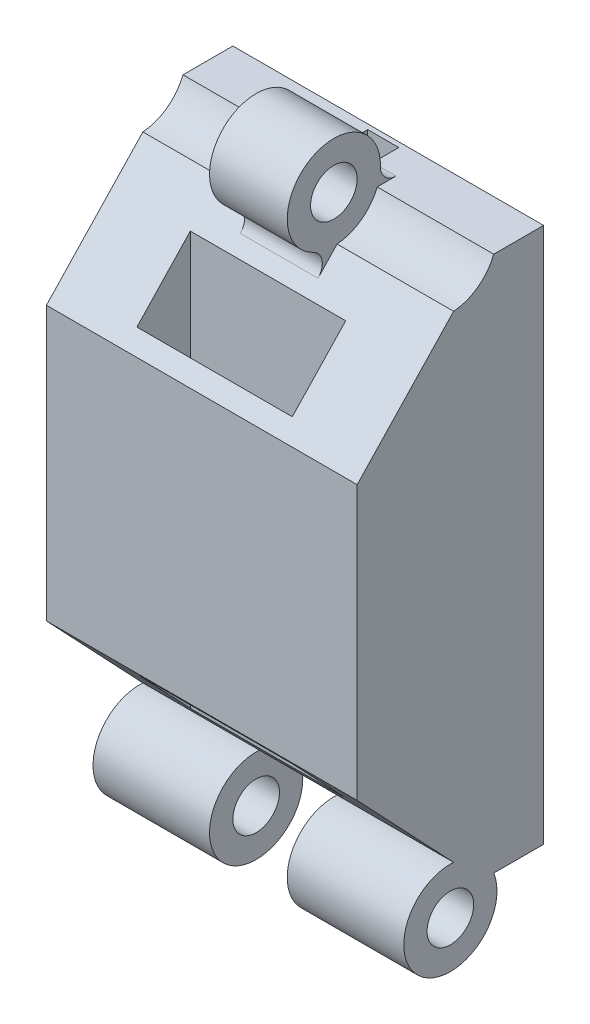
ISO-10303-21;
HEADER;
FILE_DESCRIPTION(('STEP AP214'),'2;1');
FILE_NAME('part.step','',(''),(''),'','','');
FILE_SCHEMA(('AUTOMOTIVE_DESIGN { 1 0 10303 214 1 1 1 1 }'));
ENDSEC;
DATA;
#1=APPLICATION_CONTEXT('core data for automotive mechanical design processes');
#2=APPLICATION_PROTOCOL_DEFINITION('international standard','automotive_design',2000,#1);
#3=PRODUCT_CONTEXT('',#1,'mechanical');
#4=PRODUCT('Part','Part','',(#3));
#5=PRODUCT_RELATED_PRODUCT_CATEGORY('part','',(#4));
#6=PRODUCT_DEFINITION_FORMATION('','',#4);
#7=PRODUCT_DEFINITION_CONTEXT('part definition',#1,'design');
#8=PRODUCT_DEFINITION('design','',#6,#7);
#9=PRODUCT_DEFINITION_SHAPE('','',#8);
#10=(LENGTH_UNIT() NAMED_UNIT(*) SI_UNIT(.MILLI.,.METRE.));
#11=(NAMED_UNIT(*) PLANE_ANGLE_UNIT() SI_UNIT($,.RADIAN.));
#12=(NAMED_UNIT(*) SI_UNIT($,.STERADIAN.) SOLID_ANGLE_UNIT());
#13=UNCERTAINTY_MEASURE_WITH_UNIT(LENGTH_MEASURE(1.E-05),#10,'distance_accuracy_value','');
#14=(GEOMETRIC_REPRESENTATION_CONTEXT(3) GLOBAL_UNCERTAINTY_ASSIGNED_CONTEXT((#13)) GLOBAL_UNIT_ASSIGNED_CONTEXT((#10,
#11,#12)) REPRESENTATION_CONTEXT('',''));
#15=CARTESIAN_POINT('',(0.,0.,0.));
#16=DIRECTION('',(0.,0.,1.));
#17=DIRECTION('',(1.,0.,0.));
#18=AXIS2_PLACEMENT_3D('',#15,#16,#17);
#19=CARTESIAN_POINT('',(20.4852813742386,-18.35,6.));
#20=DIRECTION('',(-1.,0.,0.));
#21=DIRECTION('',(0.,0.,1.));
#22=AXIS2_PLACEMENT_3D('',#19,#20,#21);
#23=CYLINDRICAL_SURFACE('',#22,3.);
#24=CARTESIAN_POINT('',(-0.499999999999999,-18.35,6.));
#25=DIRECTION('',(1.,0.,0.));
#26=DIRECTION('',(0.,0.,-1.));
#27=AXIS2_PLACEMENT_3D('',#24,#25,#26);
#28=CIRCLE('',#27,3.);
#29=CARTESIAN_POINT('',(-0.499999999999999,-15.3572230120332,5.79194736171735));
#30=VERTEX_POINT('',#29);
#31=CARTESIAN_POINT('',(-0.499999999999999,-17.25,3.20894285260943));
#32=VERTEX_POINT('',#31);
#33=EDGE_CURVE('E323',#30,#32,#28,.T.);
#34=ORIENTED_EDGE('',*,*,#33,.F.);
#35=DIRECTION('',(-1.,0.,0.));
#36=VECTOR('',#35,1.);
#37=CARTESIAN_POINT('',(20.4852813742386,-15.3572230120332,5.79194736171734));
#38=LINE('',#37,#36);
#39=CARTESIAN_POINT('',(-8.,-15.3572230120332,5.79194736171735));
#40=VERTEX_POINT('',#39);
#41=EDGE_CURVE('E472',#30,#40,#38,.T.);
#42=ORIENTED_EDGE('',*,*,#41,.T.);
#43=CARTESIAN_POINT('',(-8.,-18.35,6.));
#44=DIRECTION('',(1.,0.,0.));
#45=DIRECTION('',(0.,1.,0.));
#46=AXIS2_PLACEMENT_3D('',#43,#44,#45);
#47=CIRCLE('',#46,3.);
#48=CARTESIAN_POINT('',(-8.,-17.25,3.20894285260943));
#49=VERTEX_POINT('',#48);
#50=EDGE_CURVE('E328',#49,#40,#47,.F.);
#51=ORIENTED_EDGE('',*,*,#50,.F.);
#52=DIRECTION('',(-1.,0.,0.));
#53=VECTOR('',#52,1.);
#54=CARTESIAN_POINT('',(20.4852813742386,-17.25,3.20894285260943));
#55=LINE('',#54,#53);
#56=EDGE_CURVE('E345',#49,#32,#55,.F.);
#57=ORIENTED_EDGE('',*,*,#56,.T.);
#58=EDGE_LOOP('',(#34,#42,#51,#57));
#59=FACE_BOUND('',#58,.T.);
#60=ADVANCED_FACE('F50',(#59),#23,.T.);
#61=CARTESIAN_POINT('',(20.4852813742386,-18.35,6.));
#62=DIRECTION('',(-1.,0.,0.));
#63=DIRECTION('',(0.,0.,1.));
#64=AXIS2_PLACEMENT_3D('',#61,#62,#63);
#65=CYLINDRICAL_SURFACE('',#64,1.5);
#66=CARTESIAN_POINT('',(-8.,-18.35,6.));
#67=DIRECTION('',(1.,0.,0.));
#68=DIRECTION('',(0.,1.,0.));
#69=AXIS2_PLACEMENT_3D('',#66,#67,#68);
#70=CIRCLE('',#69,1.5);
#71=CARTESIAN_POINT('',(-8.,-16.85,6.));
#72=VERTEX_POINT('',#71);
#73=EDGE_CURVE('E333',#72,#72,#70,.F.);
#74=ORIENTED_EDGE('',*,*,#73,.T.);
#75=EDGE_LOOP('',(#74));
#76=FACE_BOUND('',#75,.T.);
#77=CARTESIAN_POINT('',(-0.5,-18.35,6.));
#78=DIRECTION('',(1.,0.,0.));
#79=DIRECTION('',(0.,0.,-1.));
#80=AXIS2_PLACEMENT_3D('',#77,#78,#79);
#81=CIRCLE('',#80,1.5);
#82=CARTESIAN_POINT('',(-0.5,-18.35,4.5));
#83=VERTEX_POINT('',#82);
#84=EDGE_CURVE('E337',#83,#83,#81,.T.);
#85=ORIENTED_EDGE('',*,*,#84,.T.);
#86=EDGE_LOOP('',(#85));
#87=FACE_BOUND('',#86,.T.);
#88=ADVANCED_FACE('F582',(#76,#87),#65,.F.);
#89=CARTESIAN_POINT('',(-8.,-17.25,15.));
#90=DIRECTION('',(0.,1.,0.));
#91=DIRECTION('',(-1.,0.,0.));
#92=AXIS2_PLACEMENT_3D('',#89,#90,#91);
#93=PLANE('',#92);
#94=DIRECTION('',(1.,0.,0.));
#95=VECTOR('',#94,1.);
#96=CARTESIAN_POINT('',(1.,-17.25,0.32));
#97=LINE('',#96,#95);
#98=CARTESIAN_POINT('',(1.,-17.25,0.32));
#99=VERTEX_POINT('',#98);
#100=CARTESIAN_POINT('',(3.,-17.25,0.319999999999999));
#101=VERTEX_POINT('',#100);
#102=EDGE_CURVE('E235',#99,#101,#97,.T.);
#103=ORIENTED_EDGE('',*,*,#102,.F.);
#104=DIRECTION('',(0.,0.,-1.));
#105=VECTOR('',#104,1.);
#106=CARTESIAN_POINT('',(1.,-17.25,0.32));
#107=LINE('',#106,#105);
#108=CARTESIAN_POINT('',(1.,-17.25,2.32));
#109=VERTEX_POINT('',#108);
#110=EDGE_CURVE('E222',#109,#99,#107,.T.);
#111=ORIENTED_EDGE('',*,*,#110,.F.);
#112=DIRECTION('',(1.,0.,0.));
#113=VECTOR('',#112,1.);
#114=CARTESIAN_POINT('',(1.,-17.25,2.32));
#115=LINE('',#114,#113);
#116=CARTESIAN_POINT('',(3.,-17.25,2.32));
#117=VERTEX_POINT('',#116);
#118=EDGE_CURVE('E230',#109,#117,#115,.T.);
#119=ORIENTED_EDGE('',*,*,#118,.T.);
#120=DIRECTION('',(0.,0.,-1.));
#121=VECTOR('',#120,1.);
#122=CARTESIAN_POINT('',(3.,-17.25,0.32));
#123=LINE('',#122,#121);
#124=EDGE_CURVE('E247',#117,#101,#123,.T.);
#125=ORIENTED_EDGE('',*,*,#124,.T.);
#126=EDGE_LOOP('',(#103,#111,#119,#125));
#127=FACE_BOUND('',#126,.T.);
#128=ORIENTED_EDGE('',*,*,#56,.F.);
#129=DIRECTION('',(0.,0.,-1.));
#130=VECTOR('',#129,1.);
#131=CARTESIAN_POINT('',(-8.,-17.25,15.));
#132=LINE('',#131,#130);
#133=CARTESIAN_POINT('',(-8.,-17.25,0.));
#134=VERTEX_POINT('',#133);
#135=EDGE_CURVE('E416',#49,#134,#132,.T.);
#136=ORIENTED_EDGE('',*,*,#135,.T.);
#137=DIRECTION('',(1.,0.,0.));
#138=VECTOR('',#137,1.);
#139=CARTESIAN_POINT('',(-8.,-17.25,0.));
#140=LINE('',#139,#138);
#141=CARTESIAN_POINT('',(12.,-17.25,0.));
#142=VERTEX_POINT('',#141);
#143=EDGE_CURVE('E409',#134,#142,#140,.T.);
#144=ORIENTED_EDGE('',*,*,#143,.T.);
#145=DIRECTION('',(0.,0.,-1.));
#146=VECTOR('',#145,1.);
#147=CARTESIAN_POINT('',(12.,-17.25,15.));
#148=LINE('',#147,#146);
#149=CARTESIAN_POINT('',(12.,-17.25,3.20894285260943));
#150=VERTEX_POINT('',#149);
#151=EDGE_CURVE('E413',#150,#142,#148,.T.);
#152=ORIENTED_EDGE('',*,*,#151,.F.);
#153=CARTESIAN_POINT('',(4.5,-17.25,3.20894285260943));
#154=VERTEX_POINT('',#153);
#155=EDGE_CURVE('E344',#154,#150,#55,.F.);
#156=ORIENTED_EDGE('',*,*,#155,.F.);
#157=EDGE_CURVE('E350',#32,#154,#55,.F.);
#158=ORIENTED_EDGE('',*,*,#157,.F.);
#159=EDGE_LOOP('',(#128,#136,#144,#152,#156,#158));
#160=FACE_BOUND('',#159,.T.);
#161=ADVANCED_FACE('F238',(#127,#160),#93,.F.);
#162=CARTESIAN_POINT('',(-8.,-17.25,4.));
#163=DIRECTION('',(0.,0.6875,-0.726184377413891));
#164=DIRECTION('',(0.,0.726184377413891,0.6875));
#165=AXIS2_PLACEMENT_3D('',#162,#163,#164);
#166=PLANE('',#165);
#167=DIRECTION('',(0.,0.726184377413891,0.6875));
#168=VECTOR('',#167,1.);
#169=CARTESIAN_POINT('',(7.,-17.4722955605635,3.78954628791154));
#170=LINE('',#169,#168);
#171=CARTESIAN_POINT('',(7.,-13.3021976573318,7.73750000000001));
#172=VERTEX_POINT('',#171);
#173=CARTESIAN_POINT('',(7.,-9.6712757702623,11.175));
#174=VERTEX_POINT('',#173);
#175=EDGE_CURVE('E281',#172,#174,#170,.T.);
#176=ORIENTED_EDGE('',*,*,#175,.F.);
#177=DIRECTION('',(1.,0.,0.));
#178=VECTOR('',#177,1.);
#179=CARTESIAN_POINT('',(7.,-13.3021976573318,7.73750000000001));
#180=LINE('',#179,#178);
#181=CARTESIAN_POINT('',(-3.,-13.3021976573318,7.7375));
#182=VERTEX_POINT('',#181);
#183=EDGE_CURVE('E285',#182,#172,#180,.T.);
#184=ORIENTED_EDGE('',*,*,#183,.F.);
#185=DIRECTION('',(0.,-0.726184377413891,-0.6875));
#186=VECTOR('',#185,1.);
#187=CARTESIAN_POINT('',(-3.,-19.1884734837487,2.16479042853654));
#188=LINE('',#187,#186);
#189=CARTESIAN_POINT('',(-3.,-9.6712757702623,11.175));
#190=VERTEX_POINT('',#189);
#191=EDGE_CURVE('E288',#190,#182,#188,.T.);
#192=ORIENTED_EDGE('',*,*,#191,.F.);
#193=DIRECTION('',(-1.,0.,0.));
#194=VECTOR('',#193,1.);
#195=CARTESIAN_POINT('',(-3.,-9.6712757702623,11.175));
#196=LINE('',#195,#194);
#197=EDGE_CURVE('E277',#174,#190,#196,.T.);
#198=ORIENTED_EDGE('',*,*,#197,.F.);
#199=EDGE_LOOP('',(#176,#184,#192,#198));
#200=FACE_BOUND('',#199,.T.);
#201=DIRECTION('',(0.,0.726184377413891,0.6875));
#202=VECTOR('',#201,1.);
#203=CARTESIAN_POINT('',(12.,-17.25,4.));
#204=LINE('',#203,#202);
#205=CARTESIAN_POINT('',(12.,-15.3572230120332,5.79194736171734));
#206=VERTEX_POINT('',#205);
#207=CARTESIAN_POINT('',(12.,-8.79985451736564,12.));
#208=VERTEX_POINT('',#207);
#209=EDGE_CURVE('E381',#206,#208,#204,.T.);
#210=ORIENTED_EDGE('',*,*,#209,.T.);
#211=DIRECTION('',(-1.,0.,0.));
#212=VECTOR('',#211,1.);
#213=CARTESIAN_POINT('',(-8.,-8.79985451736564,12.));
#214=LINE('',#213,#212);
#215=CARTESIAN_POINT('',(-8.,-8.79985451736564,12.));
#216=VERTEX_POINT('',#215);
#217=EDGE_CURVE('E313',#208,#216,#214,.T.);
#218=ORIENTED_EDGE('',*,*,#217,.T.);
#219=DIRECTION('',(0.,0.726184377413891,0.6875));
#220=VECTOR('',#219,1.);
#221=CARTESIAN_POINT('',(-8.,-17.25,4.));
#222=LINE('',#221,#220);
#223=EDGE_CURVE('E385',#40,#216,#222,.T.);
#224=ORIENTED_EDGE('',*,*,#223,.F.);
#225=ORIENTED_EDGE('',*,*,#41,.F.);
#226=CARTESIAN_POINT('',(4.5,-15.3572230120332,5.79194736171735));
#227=VERTEX_POINT('',#226);
#228=EDGE_CURVE('E478',#227,#30,#38,.T.);
#229=ORIENTED_EDGE('',*,*,#228,.F.);
#230=EDGE_CURVE('E473',#206,#227,#38,.T.);
#231=ORIENTED_EDGE('',*,*,#230,.F.);
#232=EDGE_LOOP('',(#210,#218,#224,#225,#229,#231));
#233=FACE_BOUND('',#232,.T.);
#234=ADVANCED_FACE('F541',(#200,#233),#166,.F.);
#235=CARTESIAN_POINT('',(-8.,18.35,6.));
#236=DIRECTION('',(1.,0.,0.));
#237=DIRECTION('',(0.,0.,-1.));
#238=AXIS2_PLACEMENT_3D('',#235,#236,#237);
#239=CYLINDRICAL_SURFACE('',#238,3.);
#240=CARTESIAN_POINT('',(-0.499999999999999,18.35,6.));
#241=DIRECTION('',(1.,0.,0.));
#242=DIRECTION('',(0.,0.,-1.));
#243=AXIS2_PLACEMENT_3D('',#240,#241,#242);
#244=CIRCLE('',#243,3.);
#245=CARTESIAN_POINT('',(-0.499999999999999,15.3572230120332,5.79194736171735));
#246=VERTEX_POINT('',#245);
#247=CARTESIAN_POINT('',(-0.499999999999999,17.25,3.20894285260943));
#248=VERTEX_POINT('',#247);
#249=EDGE_CURVE('E365',#246,#248,#244,.T.);
#250=ORIENTED_EDGE('',*,*,#249,.T.);
#251=DIRECTION('',(1.,0.,0.));
#252=VECTOR('',#251,1.);
#253=CARTESIAN_POINT('',(-8.,17.25,3.20894285260943));
#254=LINE('',#253,#252);
#255=CARTESIAN_POINT('',(-8.,17.25,3.20894285260943));
#256=VERTEX_POINT('',#255);
#257=EDGE_CURVE('E377',#256,#248,#254,.T.);
#258=ORIENTED_EDGE('',*,*,#257,.F.);
#259=CARTESIAN_POINT('',(-8.,18.35,6.));
#260=DIRECTION('',(1.,0.,0.));
#261=DIRECTION('',(0.,0.,-1.));
#262=AXIS2_PLACEMENT_3D('',#259,#260,#261);
#263=CIRCLE('',#262,3.);
#264=CARTESIAN_POINT('',(-8.,15.3572230120332,5.79194736171735));
#265=VERTEX_POINT('',#264);
#266=EDGE_CURVE('E372',#265,#256,#263,.T.);
#267=ORIENTED_EDGE('',*,*,#266,.F.);
#268=DIRECTION('',(1.,0.,0.));
#269=VECTOR('',#268,1.);
#270=CARTESIAN_POINT('',(-8.,15.3572230120332,5.79194736171735));
#271=LINE('',#270,#269);
#272=EDGE_CURVE('E426',#265,#246,#271,.T.);
#273=ORIENTED_EDGE('',*,*,#272,.T.);
#274=EDGE_LOOP('',(#250,#258,#267,#273));
#275=FACE_BOUND('',#274,.T.);
#276=ADVANCED_FACE('F769',(#275),#239,.F.);
#277=CARTESIAN_POINT('',(12.,-17.25,15.));
#278=DIRECTION('',(-1.,0.,0.));
#279=DIRECTION('',(0.,0.,1.));
#280=AXIS2_PLACEMENT_3D('',#277,#278,#279);
#281=PLANE('',#280);
#282=DIRECTION('',(0.,-0.726184377413891,0.6875));
#283=VECTOR('',#282,1.);
#284=CARTESIAN_POINT('',(12.,17.25,4.));
#285=LINE('',#284,#283);
#286=CARTESIAN_POINT('',(12.,15.3572230120332,5.79194736171735));
#287=VERTEX_POINT('',#286);
#288=CARTESIAN_POINT('',(12.,8.79985451736563,12.));
#289=VERTEX_POINT('',#288);
#290=EDGE_CURVE('E389',#287,#289,#285,.T.);
#291=ORIENTED_EDGE('',*,*,#290,.T.);
#292=DIRECTION('',(0.,1.,0.));
#293=VECTOR('',#292,1.);
#294=CARTESIAN_POINT('',(12.,0.,12.));
#295=LINE('',#294,#293);
#296=EDGE_CURVE('E302',#208,#289,#295,.T.);
#297=ORIENTED_EDGE('',*,*,#296,.F.);
#298=ORIENTED_EDGE('',*,*,#209,.F.);
#299=CARTESIAN_POINT('',(12.,-18.35,6.));
#300=DIRECTION('',(-1.,0.,0.));
#301=DIRECTION('',(0.,0.,1.));
#302=AXIS2_PLACEMENT_3D('',#299,#300,#301);
#303=CIRCLE('',#302,3.);
#304=EDGE_CURVE('E332',#150,#206,#303,.T.);
#305=ORIENTED_EDGE('',*,*,#304,.F.);
#306=ORIENTED_EDGE('',*,*,#151,.T.);
#307=DIRECTION('',(0.,1.,0.));
#308=VECTOR('',#307,1.);
#309=CARTESIAN_POINT('',(12.,-17.25,0.));
#310=LINE('',#309,#308);
#311=CARTESIAN_POINT('',(12.,17.25,0.));
#312=VERTEX_POINT('',#311);
#313=EDGE_CURVE('E397',#142,#312,#310,.T.);
#314=ORIENTED_EDGE('',*,*,#313,.T.);
#315=DIRECTION('',(0.,0.,-1.));
#316=VECTOR('',#315,1.);
#317=CARTESIAN_POINT('',(12.,17.25,15.));
#318=LINE('',#317,#316);
#319=CARTESIAN_POINT('',(12.,17.25,3.20894285260943));
#320=VERTEX_POINT('',#319);
#321=EDGE_CURVE('E422',#320,#312,#318,.T.);
#322=ORIENTED_EDGE('',*,*,#321,.F.);
#323=CARTESIAN_POINT('',(12.,18.35,6.));
#324=DIRECTION('',(1.,0.,0.));
#325=DIRECTION('',(0.,0.,-1.));
#326=AXIS2_PLACEMENT_3D('',#323,#324,#325);
#327=CIRCLE('',#326,3.);
#328=EDGE_CURVE('E363',#287,#320,#327,.T.);
#329=ORIENTED_EDGE('',*,*,#328,.F.);
#330=EDGE_LOOP('',(#291,#297,#298,#305,#306,#314,#322,#329));
#331=FACE_BOUND('',#330,.T.);
#332=CARTESIAN_POINT('',(12.,-18.35,6.));
#333=DIRECTION('',(-1.,0.,0.));
#334=DIRECTION('',(0.,0.,1.));
#335=AXIS2_PLACEMENT_3D('',#332,#333,#334);
#336=CIRCLE('',#335,1.5);
#337=CARTESIAN_POINT('',(12.,-18.35,7.5));
#338=VERTEX_POINT('',#337);
#339=EDGE_CURVE('E340',#338,#338,#336,.T.);
#340=ORIENTED_EDGE('',*,*,#339,.T.);
#341=EDGE_LOOP('',(#340));
#342=FACE_BOUND('',#341,.T.);
#343=ADVANCED_FACE('F534',(#331,#342),#281,.F.);
#344=CARTESIAN_POINT('',(-8.,17.25,15.));
#345=DIRECTION('',(0.,-1.,0.));
#346=DIRECTION('',(1.,0.,0.));
#347=AXIS2_PLACEMENT_3D('',#344,#345,#346);
#348=PLANE('',#347);
#349=DIRECTION('',(1.,0.,0.));
#350=VECTOR('',#349,1.);
#351=CARTESIAN_POINT('',(4.5,17.25,2.00125019537356));
#352=LINE('',#351,#350);
#353=CARTESIAN_POINT('',(-0.499999999999999,17.25,2.00125019537356));
#354=VERTEX_POINT('',#353);
#355=CARTESIAN_POINT('',(1.,17.25,2.00125019537356));
#356=VERTEX_POINT('',#355);
#357=EDGE_CURVE('E435',#354,#356,#352,.T.);
#358=ORIENTED_EDGE('',*,*,#357,.T.);
#359=DIRECTION('',(0.,0.,-1.));
#360=VECTOR('',#359,1.);
#361=CARTESIAN_POINT('',(1.,17.25,15.));
#362=LINE('',#361,#360);
#363=CARTESIAN_POINT('',(1.,17.25,0.32));
#364=VERTEX_POINT('',#363);
#365=EDGE_CURVE('E257',#356,#364,#362,.T.);
#366=ORIENTED_EDGE('',*,*,#365,.T.);
#367=DIRECTION('',(1.,0.,0.));
#368=VECTOR('',#367,1.);
#369=CARTESIAN_POINT('',(-8.,17.25,0.320000000000001));
#370=LINE('',#369,#368);
#371=CARTESIAN_POINT('',(3.,17.25,0.32));
#372=VERTEX_POINT('',#371);
#373=EDGE_CURVE('E12',#364,#372,#370,.T.);
#374=ORIENTED_EDGE('',*,*,#373,.T.);
#375=DIRECTION('',(0.,0.,-1.));
#376=VECTOR('',#375,1.);
#377=CARTESIAN_POINT('',(3.,17.25,15.));
#378=LINE('',#377,#376);
#379=CARTESIAN_POINT('',(3.,17.25,2.00125019537356));
#380=VERTEX_POINT('',#379);
#381=EDGE_CURVE('E253',#380,#372,#378,.T.);
#382=ORIENTED_EDGE('',*,*,#381,.F.);
#383=CARTESIAN_POINT('',(4.5,17.25,2.00125019537356));
#384=VERTEX_POINT('',#383);
#385=EDGE_CURVE('E434',#380,#384,#352,.T.);
#386=ORIENTED_EDGE('',*,*,#385,.T.);
#387=DIRECTION('',(0.,0.,1.));
#388=VECTOR('',#387,1.);
#389=CARTESIAN_POINT('',(4.5,17.25,15.));
#390=LINE('',#389,#388);
#391=CARTESIAN_POINT('',(4.5,17.25,3.20894285260943));
#392=VERTEX_POINT('',#391);
#393=EDGE_CURVE('E439',#384,#392,#390,.T.);
#394=ORIENTED_EDGE('',*,*,#393,.T.);
#395=EDGE_CURVE('E376',#392,#320,#254,.T.);
#396=ORIENTED_EDGE('',*,*,#395,.T.);
#397=ORIENTED_EDGE('',*,*,#321,.T.);
#398=DIRECTION('',(-1.,0.,0.));
#399=VECTOR('',#398,1.);
#400=CARTESIAN_POINT('',(-8.,17.25,0.));
#401=LINE('',#400,#399);
#402=CARTESIAN_POINT('',(-8.,17.25,0.));
#403=VERTEX_POINT('',#402);
#404=EDGE_CURVE('E401',#312,#403,#401,.T.);
#405=ORIENTED_EDGE('',*,*,#404,.T.);
#406=DIRECTION('',(0.,0.,-1.));
#407=VECTOR('',#406,1.);
#408=CARTESIAN_POINT('',(-8.,17.25,15.));
#409=LINE('',#408,#407);
#410=EDGE_CURVE('E419',#256,#403,#409,.T.);
#411=ORIENTED_EDGE('',*,*,#410,.F.);
#412=ORIENTED_EDGE('',*,*,#257,.T.);
#413=DIRECTION('',(0.,0.,-1.));
#414=VECTOR('',#413,1.);
#415=CARTESIAN_POINT('',(-0.499999999999999,17.25,6.));
#416=LINE('',#415,#414);
#417=EDGE_CURVE('E430',#248,#354,#416,.T.);
#418=ORIENTED_EDGE('',*,*,#417,.T.);
#419=EDGE_LOOP('',(#358,#366,#374,#382,#386,#394,#396,#397,#405,#411,#412,#418));
#420=FACE_BOUND('',#419,.T.);
#421=ADVANCED_FACE('F496',(#420),#348,.F.);
#422=CARTESIAN_POINT('',(-8.,17.25,15.));
#423=DIRECTION('',(1.,0.,0.));
#424=DIRECTION('',(0.,1.,0.));
#425=AXIS2_PLACEMENT_3D('',#422,#423,#424);
#426=PLANE('',#425);
#427=ORIENTED_EDGE('',*,*,#223,.T.);
#428=DIRECTION('',(0.,1.,0.));
#429=VECTOR('',#428,1.);
#430=CARTESIAN_POINT('',(-8.,0.,12.));
#431=LINE('',#430,#429);
#432=CARTESIAN_POINT('',(-8.,8.79985451736564,12.));
#433=VERTEX_POINT('',#432);
#434=EDGE_CURVE('E305',#216,#433,#431,.T.);
#435=ORIENTED_EDGE('',*,*,#434,.T.);
#436=DIRECTION('',(0.,-0.726184377413891,0.6875));
#437=VECTOR('',#436,1.);
#438=CARTESIAN_POINT('',(-8.,17.25,4.));
#439=LINE('',#438,#437);
#440=EDGE_CURVE('E393',#265,#433,#439,.T.);
#441=ORIENTED_EDGE('',*,*,#440,.F.);
#442=ORIENTED_EDGE('',*,*,#266,.T.);
#443=ORIENTED_EDGE('',*,*,#410,.T.);
#444=DIRECTION('',(0.,-1.,0.));
#445=VECTOR('',#444,1.);
#446=CARTESIAN_POINT('',(-8.,17.25,0.));
#447=LINE('',#446,#445);
#448=EDGE_CURVE('E405',#403,#134,#447,.T.);
#449=ORIENTED_EDGE('',*,*,#448,.T.);
#450=ORIENTED_EDGE('',*,*,#135,.F.);
#451=ORIENTED_EDGE('',*,*,#50,.T.);
#452=EDGE_LOOP('',(#427,#435,#441,#442,#443,#449,#450,#451));
#453=FACE_BOUND('',#452,.T.);
#454=ORIENTED_EDGE('',*,*,#73,.F.);
#455=EDGE_LOOP('',(#454));
#456=FACE_BOUND('',#455,.T.);
#457=ADVANCED_FACE('F552',(#453,#456),#426,.F.);
#458=CARTESIAN_POINT('',(0.,0.,0.));
#459=DIRECTION('',(0.,0.,-1.));
#460=DIRECTION('',(-1.,0.,0.));
#461=AXIS2_PLACEMENT_3D('',#458,#459,#460);
#462=PLANE('',#461);
#463=ORIENTED_EDGE('',*,*,#313,.F.);
#464=ORIENTED_EDGE('',*,*,#143,.F.);
#465=ORIENTED_EDGE('',*,*,#448,.F.);
#466=ORIENTED_EDGE('',*,*,#404,.F.);
#467=EDGE_LOOP('',(#463,#464,#465,#466));
#468=FACE_BOUND('',#467,.T.);
#469=ADVANCED_FACE('F568',(#468),#462,.T.);
#470=CARTESIAN_POINT('',(-8.,17.25,4.));
#471=DIRECTION('',(0.,0.6875,0.726184377413891));
#472=DIRECTION('',(0.,-0.726184377413891,0.6875));
#473=AXIS2_PLACEMENT_3D('',#470,#471,#472);
#474=PLANE('',#473);
#475=DIRECTION('',(-1.,0.,0.));
#476=VECTOR('',#475,1.);
#477=CARTESIAN_POINT('',(7.,13.3021976573318,7.73750000000001));
#478=LINE('',#477,#476);
#479=CARTESIAN_POINT('',(7.,13.3021976573318,7.73750000000001));
#480=VERTEX_POINT('',#479);
#481=CARTESIAN_POINT('',(-3.,13.3021976573318,7.7375));
#482=VERTEX_POINT('',#481);
#483=EDGE_CURVE('E271',#480,#482,#478,.T.);
#484=ORIENTED_EDGE('',*,*,#483,.F.);
#485=DIRECTION('',(0.,0.726184377413891,-0.6875));
#486=VECTOR('',#485,1.);
#487=CARTESIAN_POINT('',(7.,17.4722955605635,3.78954628791154));
#488=LINE('',#487,#486);
#489=CARTESIAN_POINT('',(7.,9.6712757702623,11.175));
#490=VERTEX_POINT('',#489);
#491=EDGE_CURVE('E261',#490,#480,#488,.T.);
#492=ORIENTED_EDGE('',*,*,#491,.F.);
#493=DIRECTION('',(1.,0.,0.));
#494=VECTOR('',#493,1.);
#495=CARTESIAN_POINT('',(-3.,9.6712757702623,11.175));
#496=LINE('',#495,#494);
#497=CARTESIAN_POINT('',(-3.,9.6712757702623,11.175));
#498=VERTEX_POINT('',#497);
#499=EDGE_CURVE('E262',#498,#490,#496,.T.);
#500=ORIENTED_EDGE('',*,*,#499,.F.);
#501=DIRECTION('',(0.,-0.726184377413891,0.6875));
#502=VECTOR('',#501,1.);
#503=CARTESIAN_POINT('',(-3.,19.1884734837487,2.16479042853654));
#504=LINE('',#503,#502);
#505=EDGE_CURVE('E267',#482,#498,#504,.T.);
#506=ORIENTED_EDGE('',*,*,#505,.F.);
#507=EDGE_LOOP('',(#484,#492,#500,#506));
#508=FACE_BOUND('',#507,.T.);
#509=DIRECTION('',(1.,0.,0.));
#510=VECTOR('',#509,1.);
#511=CARTESIAN_POINT('',(-8.,8.79985451736564,12.));
#512=LINE('',#511,#510);
#513=EDGE_CURVE('E309',#433,#289,#512,.T.);
#514=ORIENTED_EDGE('',*,*,#513,.T.);
#515=ORIENTED_EDGE('',*,*,#290,.F.);
#516=CARTESIAN_POINT('',(4.5,15.3572230120332,5.79194736171735));
#517=VERTEX_POINT('',#516);
#518=EDGE_CURVE('E425',#517,#287,#271,.T.);
#519=ORIENTED_EDGE('',*,*,#518,.F.);
#520=DIRECTION('',(0.,-0.726184377413891,0.6875));
#521=VECTOR('',#520,1.);
#522=CARTESIAN_POINT('',(4.5,16.8315746060559,4.39613556458075));
#523=LINE('',#522,#521);
#524=CARTESIAN_POINT('',(4.5,14.0626077019959,7.01759755928882));
#525=VERTEX_POINT('',#524);
#526=EDGE_CURVE('E456',#517,#525,#523,.T.);
#527=ORIENTED_EDGE('',*,*,#526,.T.);
#528=DIRECTION('',(-1.,0.,0.));
#529=VECTOR('',#528,1.);
#530=CARTESIAN_POINT('',(-8.,14.0626077019959,7.01759755928882));
#531=LINE('',#530,#529);
#532=CARTESIAN_POINT('',(-0.499999999999999,14.0626077019959,7.01759755928882));
#533=VERTEX_POINT('',#532);
#534=EDGE_CURVE('E452',#525,#533,#531,.T.);
#535=ORIENTED_EDGE('',*,*,#534,.T.);
#536=DIRECTION('',(0.,0.726184377413891,-0.6875));
#537=VECTOR('',#536,1.);
#538=CARTESIAN_POINT('',(-0.499999999999999,17.25,4.));
#539=LINE('',#538,#537);
#540=EDGE_CURVE('E449',#533,#246,#539,.T.);
#541=ORIENTED_EDGE('',*,*,#540,.T.);
#542=ORIENTED_EDGE('',*,*,#272,.F.);
#543=ORIENTED_EDGE('',*,*,#440,.T.);
#544=EDGE_LOOP('',(#514,#515,#519,#527,#535,#541,#542,#543));
#545=FACE_BOUND('',#544,.T.);
#546=ADVANCED_FACE('F560',(#508,#545),#474,.T.);
#547=ORIENTED_EDGE('',*,*,#395,.F.);
#548=CARTESIAN_POINT('',(4.5,18.35,6.));
#549=DIRECTION('',(1.,0.,0.));
#550=DIRECTION('',(0.,0.,-1.));
#551=AXIS2_PLACEMENT_3D('',#548,#549,#550);
#552=CIRCLE('',#551,3.);
#553=EDGE_CURVE('E359',#517,#392,#552,.T.);
#554=ORIENTED_EDGE('',*,*,#553,.F.);
#555=ORIENTED_EDGE('',*,*,#518,.T.);
#556=ORIENTED_EDGE('',*,*,#328,.T.);
#557=EDGE_LOOP('',(#547,#554,#555,#556));
#558=FACE_BOUND('',#557,.T.);
#559=ADVANCED_FACE('F575',(#558),#239,.F.);
#560=CARTESIAN_POINT('',(4.5,18.35,6.));
#561=DIRECTION('',(-1.,0.,0.));
#562=DIRECTION('',(0.,0.,1.));
#563=AXIS2_PLACEMENT_3D('',#560,#561,#562);
#564=CYLINDRICAL_SURFACE('',#563,3.);
#565=CARTESIAN_POINT('',(4.5,18.275,3.00093764653017));
#566=VERTEX_POINT('',#565);
#567=CARTESIAN_POINT('',(4.5,15.6500807764969,7.30783645252703));
#568=VERTEX_POINT('',#567);
#569=EDGE_CURVE('E364',#566,#568,#552,.T.);
#570=ORIENTED_EDGE('',*,*,#569,.F.);
#571=DIRECTION('',(-1.,0.,0.));
#572=VECTOR('',#571,1.);
#573=CARTESIAN_POINT('',(4.5,18.275,3.00093764653017));
#574=LINE('',#573,#572);
#575=CARTESIAN_POINT('',(-0.499999999999999,18.275,3.00093764653017));
#576=VERTEX_POINT('',#575);
#577=EDGE_CURVE('E446',#566,#576,#574,.T.);
#578=ORIENTED_EDGE('',*,*,#577,.T.);
#579=CARTESIAN_POINT('',(-0.499999999999999,15.6500807764969,7.30783645252703));
#580=VERTEX_POINT('',#579);
#581=EDGE_CURVE('E355',#576,#580,#244,.T.);
#582=ORIENTED_EDGE('',*,*,#581,.T.);
#583=DIRECTION('',(-1.,0.,0.));
#584=VECTOR('',#583,1.);
#585=CARTESIAN_POINT('',(4.5,15.6500807764969,7.30783645252703));
#586=LINE('',#585,#584);
#587=EDGE_CURVE('E442',#580,#568,#586,.F.);
#588=ORIENTED_EDGE('',*,*,#587,.T.);
#589=EDGE_LOOP('',(#570,#578,#582,#588));
#590=FACE_BOUND('',#589,.T.);
#591=ADVANCED_FACE('F510',(#590),#564,.T.);
#592=CARTESIAN_POINT('',(4.5,18.35,6.));
#593=DIRECTION('',(1.,0.,0.));
#594=DIRECTION('',(0.,0.,-1.));
#595=AXIS2_PLACEMENT_3D('',#592,#593,#594);
#596=PLANE('',#595);
#597=ORIENTED_EDGE('',*,*,#553,.T.);
#598=ORIENTED_EDGE('',*,*,#393,.F.);
#599=CARTESIAN_POINT('',(4.5,18.25,2.00125019537356));
#600=DIRECTION('',(1.,0.,0.));
#601=DIRECTION('',(0.,0.,-1.));
#602=AXIS2_PLACEMENT_3D('',#599,#600,#601);
#603=CIRCLE('',#602,1.);
#604=EDGE_CURVE('E460',#384,#566,#603,.F.);
#605=ORIENTED_EDGE('',*,*,#604,.T.);
#606=ORIENTED_EDGE('',*,*,#569,.T.);
#607=CARTESIAN_POINT('',(4.5,14.7501077019959,7.74378193670271));
#608=DIRECTION('',(1.,0.,0.));
#609=DIRECTION('',(0.,0.,-1.));
#610=AXIS2_PLACEMENT_3D('',#607,#608,#609);
#611=CIRCLE('',#610,1.);
#612=EDGE_CURVE('E466',#568,#525,#611,.F.);
#613=ORIENTED_EDGE('',*,*,#612,.T.);
#614=ORIENTED_EDGE('',*,*,#526,.F.);
#615=EDGE_LOOP('',(#597,#598,#605,#606,#613,#614));
#616=FACE_BOUND('',#615,.T.);
#617=CARTESIAN_POINT('',(4.5,18.35,6.));
#618=DIRECTION('',(1.,0.,0.));
#619=DIRECTION('',(0.,0.,-1.));
#620=AXIS2_PLACEMENT_3D('',#617,#618,#619);
#621=CIRCLE('',#620,1.5);
#622=CARTESIAN_POINT('',(4.5,18.35,4.5));
#623=VERTEX_POINT('',#622);
#624=EDGE_CURVE('E351',#623,#623,#621,.T.);
#625=ORIENTED_EDGE('',*,*,#624,.F.);
#626=EDGE_LOOP('',(#625));
#627=FACE_BOUND('',#626,.T.);
#628=ADVANCED_FACE('F609',(#616,#627),#596,.T.);
#629=CARTESIAN_POINT('',(-0.499999999999999,18.35,6.));
#630=DIRECTION('',(1.,0.,0.));
#631=DIRECTION('',(0.,0.,-1.));
#632=AXIS2_PLACEMENT_3D('',#629,#630,#631);
#633=PLANE('',#632);
#634=ORIENTED_EDGE('',*,*,#249,.F.);
#635=ORIENTED_EDGE('',*,*,#540,.F.);
#636=CARTESIAN_POINT('',(-0.499999999999999,14.7501077019959,7.74378193670271));
#637=DIRECTION('',(1.,0.,0.));
#638=DIRECTION('',(0.,0.,-1.));
#639=AXIS2_PLACEMENT_3D('',#636,#637,#638);
#640=CIRCLE('',#639,1.);
#641=EDGE_CURVE('E469',#533,#580,#640,.T.);
#642=ORIENTED_EDGE('',*,*,#641,.T.);
#643=ORIENTED_EDGE('',*,*,#581,.F.);
#644=CARTESIAN_POINT('',(-0.499999999999999,18.25,2.00125019537356));
#645=DIRECTION('',(1.,0.,0.));
#646=DIRECTION('',(0.,0.,-1.));
#647=AXIS2_PLACEMENT_3D('',#644,#645,#646);
#648=CIRCLE('',#647,1.);
#649=EDGE_CURVE('E463',#576,#354,#648,.T.);
#650=ORIENTED_EDGE('',*,*,#649,.T.);
#651=ORIENTED_EDGE('',*,*,#417,.F.);
#652=EDGE_LOOP('',(#634,#635,#642,#643,#650,#651));
#653=FACE_BOUND('',#652,.T.);
#654=CARTESIAN_POINT('',(-0.499999999999999,18.35,6.));
#655=DIRECTION('',(1.,0.,0.));
#656=DIRECTION('',(0.,0.,-1.));
#657=AXIS2_PLACEMENT_3D('',#654,#655,#656);
#658=CIRCLE('',#657,1.5);
#659=CARTESIAN_POINT('',(-0.499999999999999,18.35,4.5));
#660=VERTEX_POINT('',#659);
#661=EDGE_CURVE('E349',#660,#660,#658,.T.);
#662=ORIENTED_EDGE('',*,*,#661,.T.);
#663=EDGE_LOOP('',(#662));
#664=FACE_BOUND('',#663,.T.);
#665=ADVANCED_FACE('F500',(#653,#664),#633,.F.);
#666=CARTESIAN_POINT('',(4.5,18.35,6.));
#667=DIRECTION('',(-1.,0.,0.));
#668=DIRECTION('',(0.,0.,1.));
#669=AXIS2_PLACEMENT_3D('',#666,#667,#668);
#670=CYLINDRICAL_SURFACE('',#669,1.5);
#671=ORIENTED_EDGE('',*,*,#624,.T.);
#672=EDGE_LOOP('',(#671));
#673=FACE_BOUND('',#672,.T.);
#674=ORIENTED_EDGE('',*,*,#661,.F.);
#675=EDGE_LOOP('',(#674));
#676=FACE_BOUND('',#675,.T.);
#677=ADVANCED_FACE('F606',(#673,#676),#670,.F.);
#678=CARTESIAN_POINT('',(4.5,18.25,2.00125019537356));
#679=DIRECTION('',(-1.,0.,0.));
#680=DIRECTION('',(0.,0.,1.));
#681=AXIS2_PLACEMENT_3D('',#678,#679,#680);
#682=CYLINDRICAL_SURFACE('',#681,1.);
#683=DIRECTION('',(-1.,0.,0.));
#684=VECTOR('',#683,1.);
#685=CARTESIAN_POINT('',(4.5,17.3021611096549,2.32));
#686=LINE('',#685,#684);
#687=CARTESIAN_POINT('',(3.,17.3021611096549,2.32));
#688=VERTEX_POINT('',#687);
#689=CARTESIAN_POINT('',(1.,17.3021611096549,2.32));
#690=VERTEX_POINT('',#689);
#691=EDGE_CURVE('E487',#688,#690,#686,.T.);
#692=ORIENTED_EDGE('',*,*,#691,.T.);
#693=CARTESIAN_POINT('',(1.,18.25,2.00125019537356));
#694=DIRECTION('',(-1.,0.,0.));
#695=DIRECTION('',(0.,0.,1.));
#696=AXIS2_PLACEMENT_3D('',#693,#694,#695);
#697=CIRCLE('',#696,1.);
#698=EDGE_CURVE('E59',#690,#356,#697,.F.);
#699=ORIENTED_EDGE('',*,*,#698,.T.);
#700=ORIENTED_EDGE('',*,*,#357,.F.);
#701=ORIENTED_EDGE('',*,*,#649,.F.);
#702=ORIENTED_EDGE('',*,*,#577,.F.);
#703=ORIENTED_EDGE('',*,*,#604,.F.);
#704=ORIENTED_EDGE('',*,*,#385,.F.);
#705=CARTESIAN_POINT('',(3.,18.25,2.00125019537356));
#706=DIRECTION('',(-1.,0.,0.));
#707=DIRECTION('',(0.,0.,1.));
#708=AXIS2_PLACEMENT_3D('',#705,#706,#707);
#709=CIRCLE('',#708,1.);
#710=EDGE_CURVE('E477',#688,#380,#709,.F.);
#711=ORIENTED_EDGE('',*,*,#710,.F.);
#712=EDGE_LOOP('',(#692,#699,#700,#701,#702,#703,#704,#711));
#713=FACE_BOUND('',#712,.T.);
#714=ADVANCED_FACE('F492',(#713),#682,.F.);
#715=CARTESIAN_POINT('',(4.5,14.7501077019959,7.74378193670271));
#716=DIRECTION('',(-1.,0.,0.));
#717=DIRECTION('',(0.,0.,1.));
#718=AXIS2_PLACEMENT_3D('',#715,#716,#717);
#719=CYLINDRICAL_SURFACE('',#718,1.);
#720=ORIENTED_EDGE('',*,*,#641,.F.);
#721=ORIENTED_EDGE('',*,*,#534,.F.);
#722=ORIENTED_EDGE('',*,*,#612,.F.);
#723=ORIENTED_EDGE('',*,*,#587,.F.);
#724=EDGE_LOOP('',(#720,#721,#722,#723));
#725=FACE_BOUND('',#724,.T.);
#726=ADVANCED_FACE('F52',(#725),#719,.F.);
#727=ORIENTED_EDGE('',*,*,#230,.T.);
#728=CARTESIAN_POINT('',(4.5,-18.35,6.));
#729=DIRECTION('',(1.,0.,0.));
#730=DIRECTION('',(0.,0.,-1.));
#731=AXIS2_PLACEMENT_3D('',#728,#729,#730);
#732=CIRCLE('',#731,3.);
#733=EDGE_CURVE('E317',#227,#154,#732,.T.);
#734=ORIENTED_EDGE('',*,*,#733,.T.);
#735=ORIENTED_EDGE('',*,*,#155,.T.);
#736=ORIENTED_EDGE('',*,*,#304,.T.);
#737=EDGE_LOOP('',(#727,#734,#735,#736));
#738=FACE_BOUND('',#737,.T.);
#739=ADVANCED_FACE('F524',(#738),#23,.T.);
#740=CARTESIAN_POINT('',(4.5,-18.35,6.));
#741=DIRECTION('',(1.,0.,0.));
#742=DIRECTION('',(0.,0.,-1.));
#743=AXIS2_PLACEMENT_3D('',#740,#741,#742);
#744=CIRCLE('',#743,1.5);
#745=CARTESIAN_POINT('',(4.5,-18.35,4.5));
#746=VERTEX_POINT('',#745);
#747=EDGE_CURVE('E322',#746,#746,#744,.T.);
#748=ORIENTED_EDGE('',*,*,#747,.F.);
#749=EDGE_LOOP('',(#748));
#750=FACE_BOUND('',#749,.T.);
#751=ORIENTED_EDGE('',*,*,#339,.F.);
#752=EDGE_LOOP('',(#751));
#753=FACE_BOUND('',#752,.T.);
#754=ADVANCED_FACE('F590',(#750,#753),#65,.F.);
#755=CARTESIAN_POINT('',(-0.499999999999999,-18.35,6.));
#756=DIRECTION('',(1.,0.,0.));
#757=DIRECTION('',(0.,0.,-1.));
#758=AXIS2_PLACEMENT_3D('',#755,#756,#757);
#759=CYLINDRICAL_SURFACE('',#758,3.);
#760=EDGE_CURVE('E324',#154,#227,#732,.T.);
#761=ORIENTED_EDGE('',*,*,#760,.T.);
#762=ORIENTED_EDGE('',*,*,#228,.T.);
#763=EDGE_CURVE('E318',#32,#30,#28,.T.);
#764=ORIENTED_EDGE('',*,*,#763,.F.);
#765=ORIENTED_EDGE('',*,*,#157,.T.);
#766=EDGE_LOOP('',(#761,#762,#764,#765));
#767=FACE_BOUND('',#766,.T.);
#768=ADVANCED_FACE('F597',(#767),#759,.F.);
#769=CARTESIAN_POINT('',(-0.499999999999999,-18.35,6.));
#770=DIRECTION('',(1.,0.,0.));
#771=DIRECTION('',(0.,0.,-1.));
#772=AXIS2_PLACEMENT_3D('',#769,#770,#771);
#773=PLANE('',#772);
#774=ORIENTED_EDGE('',*,*,#84,.F.);
#775=EDGE_LOOP('',(#774));
#776=FACE_BOUND('',#775,.T.);
#777=ORIENTED_EDGE('',*,*,#763,.T.);
#778=ORIENTED_EDGE('',*,*,#33,.T.);
#779=EDGE_LOOP('',(#777,#778));
#780=FACE_BOUND('',#779,.T.);
#781=ADVANCED_FACE('F648',(#776,#780),#773,.T.);
#782=CARTESIAN_POINT('',(4.5,-18.35,6.));
#783=DIRECTION('',(1.,0.,0.));
#784=DIRECTION('',(0.,0.,-1.));
#785=AXIS2_PLACEMENT_3D('',#782,#783,#784);
#786=PLANE('',#785);
#787=ORIENTED_EDGE('',*,*,#747,.T.);
#788=EDGE_LOOP('',(#787));
#789=FACE_BOUND('',#788,.T.);
#790=ORIENTED_EDGE('',*,*,#760,.F.);
#791=ORIENTED_EDGE('',*,*,#733,.F.);
#792=EDGE_LOOP('',(#790,#791));
#793=FACE_BOUND('',#792,.T.);
#794=ADVANCED_FACE('F647',(#789,#793),#786,.F.);
#795=CARTESIAN_POINT('',(-8.,0.,12.));
#796=DIRECTION('',(0.,0.,-1.));
#797=DIRECTION('',(-1.,0.,0.));
#798=AXIS2_PLACEMENT_3D('',#795,#796,#797);
#799=PLANE('',#798);
#800=ORIENTED_EDGE('',*,*,#296,.T.);
#801=ORIENTED_EDGE('',*,*,#513,.F.);
#802=ORIENTED_EDGE('',*,*,#434,.F.);
#803=ORIENTED_EDGE('',*,*,#217,.F.);
#804=EDGE_LOOP('',(#800,#801,#802,#803));
#805=FACE_BOUND('',#804,.T.);
#806=ADVANCED_FACE('F555',(#805),#799,.F.);
#807=CARTESIAN_POINT('',(7.,-24.4643207059446,7.73750000000001));
#808=DIRECTION('',(0.,0.,-1.));
#809=DIRECTION('',(-1.,0.,0.));
#810=AXIS2_PLACEMENT_3D('',#807,#808,#809);
#811=PLANE('',#810);
#812=ORIENTED_EDGE('',*,*,#183,.T.);
#813=DIRECTION('',(0.,1.,0.));
#814=VECTOR('',#813,1.);
#815=CARTESIAN_POINT('',(7.,-24.4643207059446,7.73750000000001));
#816=LINE('',#815,#814);
#817=EDGE_CURVE('E282',#172,#480,#816,.T.);
#818=ORIENTED_EDGE('',*,*,#817,.T.);
#819=ORIENTED_EDGE('',*,*,#483,.T.);
#820=DIRECTION('',(0.,1.,0.));
#821=VECTOR('',#820,1.);
#822=CARTESIAN_POINT('',(-3.,-24.4643207059446,7.73750000000001));
#823=LINE('',#822,#821);
#824=EDGE_CURVE('E266',#182,#482,#823,.T.);
#825=ORIENTED_EDGE('',*,*,#824,.F.);
#826=EDGE_LOOP('',(#812,#818,#819,#825));
#827=FACE_BOUND('',#826,.T.);
#828=ADVANCED_FACE('F637',(#827),#811,.F.);
#829=CARTESIAN_POINT('',(7.,-24.4643207059446,11.175));
#830=DIRECTION('',(1.,0.,0.));
#831=DIRECTION('',(0.,0.,-1.));
#832=AXIS2_PLACEMENT_3D('',#829,#830,#831);
#833=PLANE('',#832);
#834=ORIENTED_EDGE('',*,*,#175,.T.);
#835=DIRECTION('',(0.,1.,0.));
#836=VECTOR('',#835,1.);
#837=CARTESIAN_POINT('',(7.,-24.4643207059446,11.175));
#838=LINE('',#837,#836);
#839=EDGE_CURVE('E291',#174,#490,#838,.T.);
#840=ORIENTED_EDGE('',*,*,#839,.T.);
#841=ORIENTED_EDGE('',*,*,#491,.T.);
#842=ORIENTED_EDGE('',*,*,#817,.F.);
#843=EDGE_LOOP('',(#834,#840,#841,#842));
#844=FACE_BOUND('',#843,.T.);
#845=ADVANCED_FACE('F634',(#844),#833,.F.);
#846=CARTESIAN_POINT('',(-3.,-24.4643207059446,11.175));
#847=DIRECTION('',(0.,0.,1.));
#848=DIRECTION('',(1.,0.,0.));
#849=AXIS2_PLACEMENT_3D('',#846,#847,#848);
#850=PLANE('',#849);
#851=ORIENTED_EDGE('',*,*,#197,.T.);
#852=DIRECTION('',(0.,1.,0.));
#853=VECTOR('',#852,1.);
#854=CARTESIAN_POINT('',(-3.,-24.4643207059446,11.175));
#855=LINE('',#854,#853);
#856=EDGE_CURVE('E294',#190,#498,#855,.T.);
#857=ORIENTED_EDGE('',*,*,#856,.T.);
#858=ORIENTED_EDGE('',*,*,#499,.T.);
#859=ORIENTED_EDGE('',*,*,#839,.F.);
#860=EDGE_LOOP('',(#851,#857,#858,#859));
#861=FACE_BOUND('',#860,.T.);
#862=ADVANCED_FACE('F628',(#861),#850,.F.);
#863=CARTESIAN_POINT('',(-3.,-24.4643207059446,7.73750000000001));
#864=DIRECTION('',(-1.,0.,0.));
#865=DIRECTION('',(0.,0.,1.));
#866=AXIS2_PLACEMENT_3D('',#863,#864,#865);
#867=PLANE('',#866);
#868=ORIENTED_EDGE('',*,*,#191,.T.);
#869=ORIENTED_EDGE('',*,*,#824,.T.);
#870=ORIENTED_EDGE('',*,*,#505,.T.);
#871=ORIENTED_EDGE('',*,*,#856,.F.);
#872=EDGE_LOOP('',(#868,#869,#870,#871));
#873=FACE_BOUND('',#872,.T.);
#874=ADVANCED_FACE('F621',(#873),#867,.F.);
#875=CARTESIAN_POINT('',(1.,21.5987472816461,0.32));
#876=DIRECTION('',(0.,0.,-1.));
#877=DIRECTION('',(-1.,0.,0.));
#878=AXIS2_PLACEMENT_3D('',#875,#876,#877);
#879=PLANE('',#878);
#880=DIRECTION('',(0.,1.,0.));
#881=VECTOR('',#880,1.);
#882=CARTESIAN_POINT('',(1.,21.5987472816461,0.32));
#883=LINE('',#882,#881);
#884=EDGE_CURVE('E236',#99,#364,#883,.T.);
#885=ORIENTED_EDGE('',*,*,#884,.F.);
#886=ORIENTED_EDGE('',*,*,#102,.T.);
#887=DIRECTION('',(0.,1.,0.));
#888=VECTOR('',#887,1.);
#889=CARTESIAN_POINT('',(3.,21.5987472816461,0.32));
#890=LINE('',#889,#888);
#891=EDGE_CURVE('E66',#101,#372,#890,.T.);
#892=ORIENTED_EDGE('',*,*,#891,.T.);
#893=ORIENTED_EDGE('',*,*,#373,.F.);
#894=EDGE_LOOP('',(#885,#886,#892,#893));
#895=FACE_BOUND('',#894,.T.);
#896=ADVANCED_FACE('F619',(#895),#879,.F.);
#897=CARTESIAN_POINT('',(1.,-17.25,2.32));
#898=DIRECTION('',(0.,0.,1.));
#899=DIRECTION('',(1.,0.,0.));
#900=AXIS2_PLACEMENT_3D('',#897,#898,#899);
#901=PLANE('',#900);
#902=DIRECTION('',(0.,-1.,0.));
#903=VECTOR('',#902,1.);
#904=CARTESIAN_POINT('',(3.,-17.25,2.32));
#905=LINE('',#904,#903);
#906=EDGE_CURVE('E72',#688,#117,#905,.T.);
#907=ORIENTED_EDGE('',*,*,#906,.T.);
#908=ORIENTED_EDGE('',*,*,#118,.F.);
#909=DIRECTION('',(0.,-1.,0.));
#910=VECTOR('',#909,1.);
#911=CARTESIAN_POINT('',(1.,-17.25,2.32));
#912=LINE('',#911,#910);
#913=EDGE_CURVE('E217',#690,#109,#912,.T.);
#914=ORIENTED_EDGE('',*,*,#913,.F.);
#915=ORIENTED_EDGE('',*,*,#691,.F.);
#916=EDGE_LOOP('',(#907,#908,#914,#915));
#917=FACE_BOUND('',#916,.T.);
#918=ADVANCED_FACE('F231',(#917),#901,.F.);
#919=CARTESIAN_POINT('',(1.,0.,0.));
#920=DIRECTION('',(-1.,0.,0.));
#921=DIRECTION('',(0.,0.,1.));
#922=AXIS2_PLACEMENT_3D('',#919,#920,#921);
#923=PLANE('',#922);
#924=ORIENTED_EDGE('',*,*,#698,.F.);
#925=ORIENTED_EDGE('',*,*,#913,.T.);
#926=ORIENTED_EDGE('',*,*,#110,.T.);
#927=ORIENTED_EDGE('',*,*,#884,.T.);
#928=ORIENTED_EDGE('',*,*,#365,.F.);
#929=EDGE_LOOP('',(#924,#925,#926,#927,#928));
#930=FACE_BOUND('',#929,.T.);
#931=ADVANCED_FACE('F219',(#930),#923,.F.);
#932=CARTESIAN_POINT('',(3.,0.,0.));
#933=DIRECTION('',(-1.,0.,0.));
#934=DIRECTION('',(0.,0.,1.));
#935=AXIS2_PLACEMENT_3D('',#932,#933,#934);
#936=PLANE('',#935);
#937=ORIENTED_EDGE('',*,*,#381,.T.);
#938=ORIENTED_EDGE('',*,*,#891,.F.);
#939=ORIENTED_EDGE('',*,*,#124,.F.);
#940=ORIENTED_EDGE('',*,*,#906,.F.);
#941=ORIENTED_EDGE('',*,*,#710,.T.);
#942=EDGE_LOOP('',(#937,#938,#939,#940,#941));
#943=FACE_BOUND('',#942,.T.);
#944=ADVANCED_FACE('F617',(#943),#936,.T.);
#945=CLOSED_SHELL('',(#60,#88,#161,#234,#276,#343,#421,#457,#469,#546,#559,#591,#628,#665,#677,
#714,#726,#739,#754,#768,#781,#794,#806,#828,#845,#862,#874,#896,#918,#931,#944));
#946=MANIFOLD_SOLID_BREP('B2',#945);
#947=ADVANCED_BREP_SHAPE_REPRESENTATION('',(#18,#946),#14);
#948=SHAPE_DEFINITION_REPRESENTATION(#9,#947);
ENDSEC;
END-ISO-10303-21;
